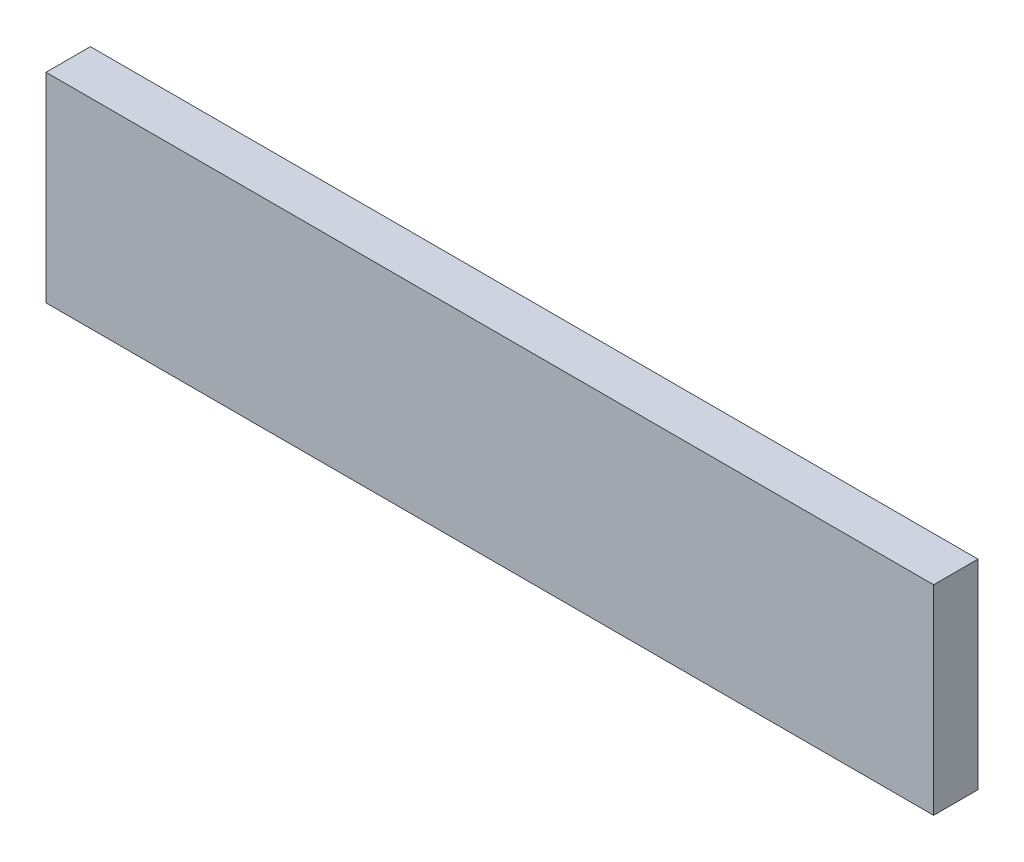
ISO-10303-21;
HEADER;
FILE_DESCRIPTION(('STEP AP214'),'2;1');
FILE_NAME('part.step','',(''),(''),'','','');
FILE_SCHEMA(('AUTOMOTIVE_DESIGN { 1 0 10303 214 1 1 1 1 }'));
ENDSEC;
DATA;
#1=APPLICATION_CONTEXT('core data for automotive mechanical design processes');
#2=APPLICATION_PROTOCOL_DEFINITION('international standard','automotive_design',2000,#1);
#3=PRODUCT_CONTEXT('',#1,'mechanical');
#4=PRODUCT('Part','Part','',(#3));
#5=PRODUCT_RELATED_PRODUCT_CATEGORY('part','',(#4));
#6=PRODUCT_DEFINITION_FORMATION('','',#4);
#7=PRODUCT_DEFINITION_CONTEXT('part definition',#1,'design');
#8=PRODUCT_DEFINITION('design','',#6,#7);
#9=PRODUCT_DEFINITION_SHAPE('','',#8);
#10=(LENGTH_UNIT() NAMED_UNIT(*) SI_UNIT(.MILLI.,.METRE.));
#11=(NAMED_UNIT(*) PLANE_ANGLE_UNIT() SI_UNIT($,.RADIAN.));
#12=(NAMED_UNIT(*) SI_UNIT($,.STERADIAN.) SOLID_ANGLE_UNIT());
#13=UNCERTAINTY_MEASURE_WITH_UNIT(LENGTH_MEASURE(1.E-05),#10,'distance_accuracy_value','');
#14=(GEOMETRIC_REPRESENTATION_CONTEXT(3) GLOBAL_UNCERTAINTY_ASSIGNED_CONTEXT((#13)) GLOBAL_UNIT_ASSIGNED_CONTEXT((#10,
#11,#12)) REPRESENTATION_CONTEXT('',''));
#15=CARTESIAN_POINT('',(0.,0.,0.));
#16=DIRECTION('',(0.,0.,1.));
#17=DIRECTION('',(1.,0.,0.));
#18=AXIS2_PLACEMENT_3D('',#15,#16,#17);
#19=CARTESIAN_POINT('',(-123.621120621464,34.7998479798228,20.));
#20=DIRECTION('',(1.,0.,0.));
#21=DIRECTION('',(0.,1.,0.));
#22=AXIS2_PLACEMENT_3D('',#19,#20,#21);
#23=PLANE('',#22);
#24=DIRECTION('',(0.,-1.,0.));
#25=VECTOR('',#24,1.);
#26=CARTESIAN_POINT('',(-123.621120621464,34.7998479798228,0.));
#27=LINE('',#26,#25);
#28=CARTESIAN_POINT('',(-123.621120621464,34.7998479798228,0.));
#29=VERTEX_POINT('',#28);
#30=CARTESIAN_POINT('',(-123.621120621464,-55.2001520201772,0.));
#31=VERTEX_POINT('',#30);
#32=EDGE_CURVE('E95',#29,#31,#27,.T.);
#33=ORIENTED_EDGE('',*,*,#32,.T.);
#34=DIRECTION('',(0.,0.,-1.));
#35=VECTOR('',#34,1.);
#36=CARTESIAN_POINT('',(-123.621120621464,-55.2001520201772,20.));
#37=LINE('',#36,#35);
#38=CARTESIAN_POINT('',(-123.621120621464,-55.2001520201772,20.));
#39=VERTEX_POINT('',#38);
#40=EDGE_CURVE('E11',#39,#31,#37,.T.);
#41=ORIENTED_EDGE('',*,*,#40,.F.);
#42=DIRECTION('',(0.,-1.,0.));
#43=VECTOR('',#42,1.);
#44=CARTESIAN_POINT('',(-123.621120621464,34.7998479798228,20.));
#45=LINE('',#44,#43);
#46=CARTESIAN_POINT('',(-123.621120621464,34.7998479798228,20.));
#47=VERTEX_POINT('',#46);
#48=EDGE_CURVE('E83',#47,#39,#45,.T.);
#49=ORIENTED_EDGE('',*,*,#48,.F.);
#50=DIRECTION('',(0.,0.,-1.));
#51=VECTOR('',#50,1.);
#52=CARTESIAN_POINT('',(-123.621120621464,34.7998479798228,20.));
#53=LINE('',#52,#51);
#54=EDGE_CURVE('E91',#47,#29,#53,.T.);
#55=ORIENTED_EDGE('',*,*,#54,.T.);
#56=EDGE_LOOP('',(#33,#41,#49,#55));
#57=FACE_BOUND('',#56,.T.);
#58=ADVANCED_FACE('F32',(#57),#23,.F.);
#59=CARTESIAN_POINT('',(-123.621120621464,-55.2001520201772,20.));
#60=DIRECTION('',(0.,1.,0.));
#61=DIRECTION('',(0.,0.,1.));
#62=AXIS2_PLACEMENT_3D('',#59,#60,#61);
#63=PLANE('',#62);
#64=DIRECTION('',(1.,0.,0.));
#65=VECTOR('',#64,1.);
#66=CARTESIAN_POINT('',(-123.621120621464,-55.2001520201772,0.));
#67=LINE('',#66,#65);
#68=CARTESIAN_POINT('',(276.378879378536,-55.2001520201772,0.));
#69=VERTEX_POINT('',#68);
#70=EDGE_CURVE('E87',#31,#69,#67,.T.);
#71=ORIENTED_EDGE('',*,*,#70,.T.);
#72=DIRECTION('',(0.,0.,-1.));
#73=VECTOR('',#72,1.);
#74=CARTESIAN_POINT('',(276.378879378536,-55.2001520201772,20.));
#75=LINE('',#74,#73);
#76=CARTESIAN_POINT('',(276.378879378536,-55.2001520201772,20.));
#77=VERTEX_POINT('',#76);
#78=EDGE_CURVE('E40',#77,#69,#75,.T.);
#79=ORIENTED_EDGE('',*,*,#78,.F.);
#80=DIRECTION('',(1.,0.,0.));
#81=VECTOR('',#80,1.);
#82=CARTESIAN_POINT('',(-123.621120621464,-55.2001520201772,20.));
#83=LINE('',#82,#81);
#84=EDGE_CURVE('E78',#39,#77,#83,.T.);
#85=ORIENTED_EDGE('',*,*,#84,.F.);
#86=ORIENTED_EDGE('',*,*,#40,.T.);
#87=EDGE_LOOP('',(#71,#79,#85,#86));
#88=FACE_BOUND('',#87,.T.);
#89=ADVANCED_FACE('F86',(#88),#63,.F.);
#90=CARTESIAN_POINT('',(276.378879378536,34.7998479798228,20.));
#91=DIRECTION('',(-1.,0.,0.));
#92=DIRECTION('',(0.,0.,1.));
#93=AXIS2_PLACEMENT_3D('',#90,#91,#92);
#94=PLANE('',#93);
#95=DIRECTION('',(0.,1.,0.));
#96=VECTOR('',#95,1.);
#97=CARTESIAN_POINT('',(276.378879378536,34.7998479798228,0.));
#98=LINE('',#97,#96);
#99=CARTESIAN_POINT('',(276.378879378536,34.7998479798228,0.));
#100=VERTEX_POINT('',#99);
#101=EDGE_CURVE('E65',#69,#100,#98,.T.);
#102=ORIENTED_EDGE('',*,*,#101,.T.);
#103=DIRECTION('',(0.,0.,-1.));
#104=VECTOR('',#103,1.);
#105=CARTESIAN_POINT('',(276.378879378536,34.7998479798228,20.));
#106=LINE('',#105,#104);
#107=CARTESIAN_POINT('',(276.378879378536,34.7998479798228,20.));
#108=VERTEX_POINT('',#107);
#109=EDGE_CURVE('E88',#108,#100,#106,.T.);
#110=ORIENTED_EDGE('',*,*,#109,.F.);
#111=DIRECTION('',(0.,1.,0.));
#112=VECTOR('',#111,1.);
#113=CARTESIAN_POINT('',(276.378879378536,34.7998479798228,20.));
#114=LINE('',#113,#112);
#115=EDGE_CURVE('E81',#77,#108,#114,.T.);
#116=ORIENTED_EDGE('',*,*,#115,.F.);
#117=ORIENTED_EDGE('',*,*,#78,.T.);
#118=EDGE_LOOP('',(#102,#110,#116,#117));
#119=FACE_BOUND('',#118,.T.);
#120=ADVANCED_FACE('F89',(#119),#94,.F.);
#121=CARTESIAN_POINT('',(-123.621120621464,34.7998479798228,20.));
#122=DIRECTION('',(0.,-1.,0.));
#123=DIRECTION('',(0.,0.,-1.));
#124=AXIS2_PLACEMENT_3D('',#121,#122,#123);
#125=PLANE('',#124);
#126=DIRECTION('',(-1.,0.,0.));
#127=VECTOR('',#126,1.);
#128=CARTESIAN_POINT('',(-123.621120621464,34.7998479798228,0.));
#129=LINE('',#128,#127);
#130=EDGE_CURVE('E71',#100,#29,#129,.T.);
#131=ORIENTED_EDGE('',*,*,#130,.T.);
#132=ORIENTED_EDGE('',*,*,#54,.F.);
#133=DIRECTION('',(-1.,0.,0.));
#134=VECTOR('',#133,1.);
#135=CARTESIAN_POINT('',(-123.621120621464,34.7998479798228,20.));
#136=LINE('',#135,#134);
#137=EDGE_CURVE('E48',#108,#47,#136,.T.);
#138=ORIENTED_EDGE('',*,*,#137,.F.);
#139=ORIENTED_EDGE('',*,*,#109,.T.);
#140=EDGE_LOOP('',(#131,#132,#138,#139));
#141=FACE_BOUND('',#140,.T.);
#142=ADVANCED_FACE('F102',(#141),#125,.F.);
#143=CARTESIAN_POINT('',(0.,0.,20.));
#144=DIRECTION('',(0.,0.,1.));
#145=DIRECTION('',(1.,0.,0.));
#146=AXIS2_PLACEMENT_3D('',#143,#144,#145);
#147=PLANE('',#146);
#148=ORIENTED_EDGE('',*,*,#48,.T.);
#149=ORIENTED_EDGE('',*,*,#84,.T.);
#150=ORIENTED_EDGE('',*,*,#115,.T.);
#151=ORIENTED_EDGE('',*,*,#137,.T.);
#152=EDGE_LOOP('',(#148,#149,#150,#151));
#153=FACE_BOUND('',#152,.T.);
#154=ADVANCED_FACE('F79',(#153),#147,.T.);
#155=CARTESIAN_POINT('',(0.,0.,0.));
#156=DIRECTION('',(0.,0.,1.));
#157=DIRECTION('',(1.,0.,0.));
#158=AXIS2_PLACEMENT_3D('',#155,#156,#157);
#159=PLANE('',#158);
#160=ORIENTED_EDGE('',*,*,#32,.F.);
#161=ORIENTED_EDGE('',*,*,#130,.F.);
#162=ORIENTED_EDGE('',*,*,#101,.F.);
#163=ORIENTED_EDGE('',*,*,#70,.F.);
#164=EDGE_LOOP('',(#160,#161,#162,#163));
#165=FACE_BOUND('',#164,.T.);
#166=ADVANCED_FACE('F105',(#165),#159,.F.);
#167=CLOSED_SHELL('',(#58,#89,#120,#142,#154,#166));
#168=MANIFOLD_SOLID_BREP('B2',#167);
#169=ADVANCED_BREP_SHAPE_REPRESENTATION('',(#18,#168),#14);
#170=SHAPE_DEFINITION_REPRESENTATION(#9,#169);
ENDSEC;
END-ISO-10303-21;
